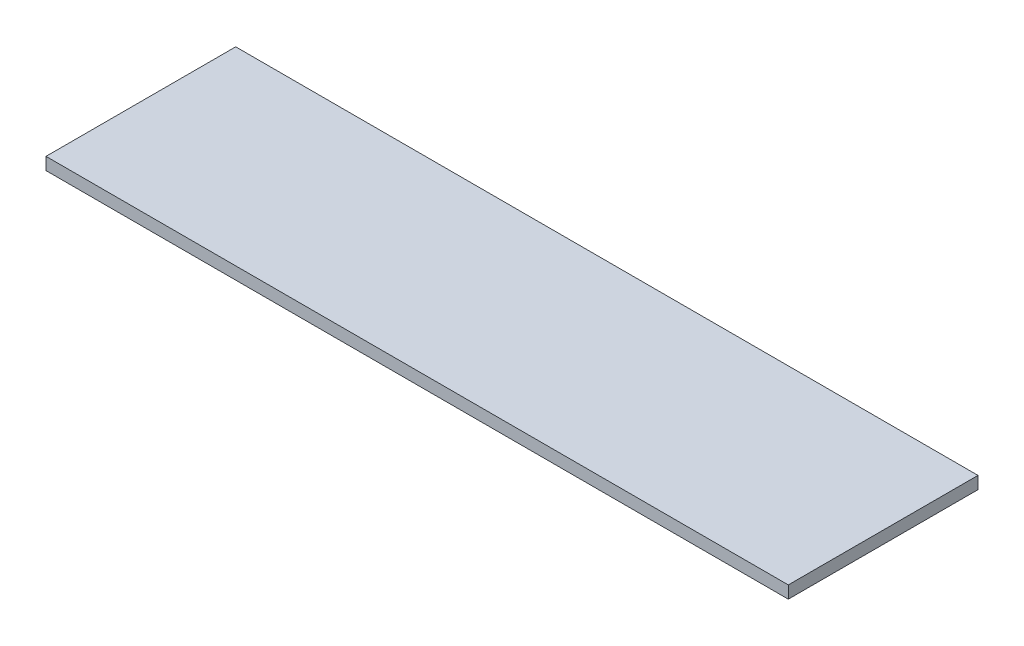
ISO-10303-21;
HEADER;
FILE_DESCRIPTION(('STEP AP214'),'2;1');
FILE_NAME('part.step','',(''),(''),'','','');
FILE_SCHEMA(('AUTOMOTIVE_DESIGN { 1 0 10303 214 1 1 1 1 }'));
ENDSEC;
DATA;
#1=APPLICATION_CONTEXT('core data for automotive mechanical design processes');
#2=APPLICATION_PROTOCOL_DEFINITION('international standard','automotive_design',2000,#1);
#3=PRODUCT_CONTEXT('',#1,'mechanical');
#4=PRODUCT('Part','Part','',(#3));
#5=PRODUCT_RELATED_PRODUCT_CATEGORY('part','',(#4));
#6=PRODUCT_DEFINITION_FORMATION('','',#4);
#7=PRODUCT_DEFINITION_CONTEXT('part definition',#1,'design');
#8=PRODUCT_DEFINITION('design','',#6,#7);
#9=PRODUCT_DEFINITION_SHAPE('','',#8);
#10=(LENGTH_UNIT() NAMED_UNIT(*) SI_UNIT(.MILLI.,.METRE.));
#11=(NAMED_UNIT(*) PLANE_ANGLE_UNIT() SI_UNIT($,.RADIAN.));
#12=(NAMED_UNIT(*) SI_UNIT($,.STERADIAN.) SOLID_ANGLE_UNIT());
#13=UNCERTAINTY_MEASURE_WITH_UNIT(LENGTH_MEASURE(1.E-05),#10,'distance_accuracy_value','');
#14=(GEOMETRIC_REPRESENTATION_CONTEXT(3) GLOBAL_UNCERTAINTY_ASSIGNED_CONTEXT((#13)) GLOBAL_UNIT_ASSIGNED_CONTEXT((#10,
#11,#12)) REPRESENTATION_CONTEXT('',''));
#15=CARTESIAN_POINT('',(0.,0.,0.));
#16=DIRECTION('',(0.,0.,1.));
#17=DIRECTION('',(1.,0.,0.));
#18=AXIS2_PLACEMENT_3D('',#15,#16,#17);
#19=CARTESIAN_POINT('',(-80.,1.5,-23.));
#20=DIRECTION('',(1.,0.,0.));
#21=DIRECTION('',(0.,0.,-1.));
#22=AXIS2_PLACEMENT_3D('',#19,#20,#21);
#23=PLANE('',#22);
#24=DIRECTION('',(0.,0.,1.));
#25=VECTOR('',#24,1.);
#26=CARTESIAN_POINT('',(-80.,-1.5,-23.));
#27=LINE('',#26,#25);
#28=CARTESIAN_POINT('',(-80.,-1.5,-23.));
#29=VERTEX_POINT('',#28);
#30=CARTESIAN_POINT('',(-80.,-1.5,23.));
#31=VERTEX_POINT('',#30);
#32=EDGE_CURVE('E94',#29,#31,#27,.T.);
#33=ORIENTED_EDGE('',*,*,#32,.T.);
#34=DIRECTION('',(0.,-1.,0.));
#35=VECTOR('',#34,1.);
#36=CARTESIAN_POINT('',(-80.,1.5,23.));
#37=LINE('',#36,#35);
#38=CARTESIAN_POINT('',(-80.,1.5,23.));
#39=VERTEX_POINT('',#38);
#40=EDGE_CURVE('E11',#39,#31,#37,.T.);
#41=ORIENTED_EDGE('',*,*,#40,.F.);
#42=DIRECTION('',(0.,0.,1.));
#43=VECTOR('',#42,1.);
#44=CARTESIAN_POINT('',(-80.,1.5,-23.));
#45=LINE('',#44,#43);
#46=CARTESIAN_POINT('',(-80.,1.5,-23.));
#47=VERTEX_POINT('',#46);
#48=EDGE_CURVE('E82',#47,#39,#45,.T.);
#49=ORIENTED_EDGE('',*,*,#48,.F.);
#50=DIRECTION('',(0.,-1.,0.));
#51=VECTOR('',#50,1.);
#52=CARTESIAN_POINT('',(-80.,1.5,-23.));
#53=LINE('',#52,#51);
#54=EDGE_CURVE('E90',#47,#29,#53,.T.);
#55=ORIENTED_EDGE('',*,*,#54,.T.);
#56=EDGE_LOOP('',(#33,#41,#49,#55));
#57=FACE_BOUND('',#56,.T.);
#58=ADVANCED_FACE('F31',(#57),#23,.F.);
#59=CARTESIAN_POINT('',(-80.,1.5,23.));
#60=DIRECTION('',(0.,0.,-1.));
#61=DIRECTION('',(-1.,0.,0.));
#62=AXIS2_PLACEMENT_3D('',#59,#60,#61);
#63=PLANE('',#62);
#64=DIRECTION('',(1.,0.,0.));
#65=VECTOR('',#64,1.);
#66=CARTESIAN_POINT('',(-80.,-1.5,23.));
#67=LINE('',#66,#65);
#68=CARTESIAN_POINT('',(100.,-1.5,23.));
#69=VERTEX_POINT('',#68);
#70=EDGE_CURVE('E86',#31,#69,#67,.T.);
#71=ORIENTED_EDGE('',*,*,#70,.T.);
#72=DIRECTION('',(0.,-1.,0.));
#73=VECTOR('',#72,1.);
#74=CARTESIAN_POINT('',(100.,1.5,23.));
#75=LINE('',#74,#73);
#76=CARTESIAN_POINT('',(100.,1.5,23.));
#77=VERTEX_POINT('',#76);
#78=EDGE_CURVE('E39',#77,#69,#75,.T.);
#79=ORIENTED_EDGE('',*,*,#78,.F.);
#80=DIRECTION('',(1.,0.,0.));
#81=VECTOR('',#80,1.);
#82=CARTESIAN_POINT('',(-80.,1.5,23.));
#83=LINE('',#82,#81);
#84=EDGE_CURVE('E77',#39,#77,#83,.T.);
#85=ORIENTED_EDGE('',*,*,#84,.F.);
#86=ORIENTED_EDGE('',*,*,#40,.T.);
#87=EDGE_LOOP('',(#71,#79,#85,#86));
#88=FACE_BOUND('',#87,.T.);
#89=ADVANCED_FACE('F85',(#88),#63,.F.);
#90=CARTESIAN_POINT('',(100.,1.5,-23.));
#91=DIRECTION('',(-1.,0.,0.));
#92=DIRECTION('',(0.,0.,1.));
#93=AXIS2_PLACEMENT_3D('',#90,#91,#92);
#94=PLANE('',#93);
#95=DIRECTION('',(0.,0.,-1.));
#96=VECTOR('',#95,1.);
#97=CARTESIAN_POINT('',(100.,-1.5,-23.));
#98=LINE('',#97,#96);
#99=CARTESIAN_POINT('',(100.,-1.5,-23.));
#100=VERTEX_POINT('',#99);
#101=EDGE_CURVE('E64',#69,#100,#98,.T.);
#102=ORIENTED_EDGE('',*,*,#101,.T.);
#103=DIRECTION('',(0.,-1.,0.));
#104=VECTOR('',#103,1.);
#105=CARTESIAN_POINT('',(100.,1.5,-23.));
#106=LINE('',#105,#104);
#107=CARTESIAN_POINT('',(100.,1.5,-23.));
#108=VERTEX_POINT('',#107);
#109=EDGE_CURVE('E87',#108,#100,#106,.T.);
#110=ORIENTED_EDGE('',*,*,#109,.F.);
#111=DIRECTION('',(0.,0.,-1.));
#112=VECTOR('',#111,1.);
#113=CARTESIAN_POINT('',(100.,1.5,-23.));
#114=LINE('',#113,#112);
#115=EDGE_CURVE('E80',#77,#108,#114,.T.);
#116=ORIENTED_EDGE('',*,*,#115,.F.);
#117=ORIENTED_EDGE('',*,*,#78,.T.);
#118=EDGE_LOOP('',(#102,#110,#116,#117));
#119=FACE_BOUND('',#118,.T.);
#120=ADVANCED_FACE('F88',(#119),#94,.F.);
#121=CARTESIAN_POINT('',(-80.,1.5,-23.));
#122=DIRECTION('',(0.,0.,1.));
#123=DIRECTION('',(1.,0.,0.));
#124=AXIS2_PLACEMENT_3D('',#121,#122,#123);
#125=PLANE('',#124);
#126=DIRECTION('',(-1.,0.,0.));
#127=VECTOR('',#126,1.);
#128=CARTESIAN_POINT('',(-80.,-1.5,-23.));
#129=LINE('',#128,#127);
#130=EDGE_CURVE('E70',#100,#29,#129,.T.);
#131=ORIENTED_EDGE('',*,*,#130,.T.);
#132=ORIENTED_EDGE('',*,*,#54,.F.);
#133=DIRECTION('',(-1.,0.,0.));
#134=VECTOR('',#133,1.);
#135=CARTESIAN_POINT('',(-80.,1.5,-23.));
#136=LINE('',#135,#134);
#137=EDGE_CURVE('E47',#108,#47,#136,.T.);
#138=ORIENTED_EDGE('',*,*,#137,.F.);
#139=ORIENTED_EDGE('',*,*,#109,.T.);
#140=EDGE_LOOP('',(#131,#132,#138,#139));
#141=FACE_BOUND('',#140,.T.);
#142=ADVANCED_FACE('F101',(#141),#125,.F.);
#143=CARTESIAN_POINT('',(-80.,1.5,23.));
#144=DIRECTION('',(0.,1.,0.));
#145=DIRECTION('',(0.,0.,1.));
#146=AXIS2_PLACEMENT_3D('',#143,#144,#145);
#147=PLANE('',#146);
#148=ORIENTED_EDGE('',*,*,#48,.T.);
#149=ORIENTED_EDGE('',*,*,#84,.T.);
#150=ORIENTED_EDGE('',*,*,#115,.T.);
#151=ORIENTED_EDGE('',*,*,#137,.T.);
#152=EDGE_LOOP('',(#148,#149,#150,#151));
#153=FACE_BOUND('',#152,.T.);
#154=ADVANCED_FACE('F78',(#153),#147,.T.);
#155=CARTESIAN_POINT('',(-80.,-1.5,23.));
#156=DIRECTION('',(0.,1.,0.));
#157=DIRECTION('',(0.,0.,1.));
#158=AXIS2_PLACEMENT_3D('',#155,#156,#157);
#159=PLANE('',#158);
#160=ORIENTED_EDGE('',*,*,#32,.F.);
#161=ORIENTED_EDGE('',*,*,#130,.F.);
#162=ORIENTED_EDGE('',*,*,#101,.F.);
#163=ORIENTED_EDGE('',*,*,#70,.F.);
#164=EDGE_LOOP('',(#160,#161,#162,#163));
#165=FACE_BOUND('',#164,.T.);
#166=ADVANCED_FACE('F104',(#165),#159,.F.);
#167=CLOSED_SHELL('',(#58,#89,#120,#142,#154,#166));
#168=MANIFOLD_SOLID_BREP('B2',#167);
#169=ADVANCED_BREP_SHAPE_REPRESENTATION('',(#18,#168),#14);
#170=SHAPE_DEFINITION_REPRESENTATION(#9,#169);
ENDSEC;
END-ISO-10303-21;
